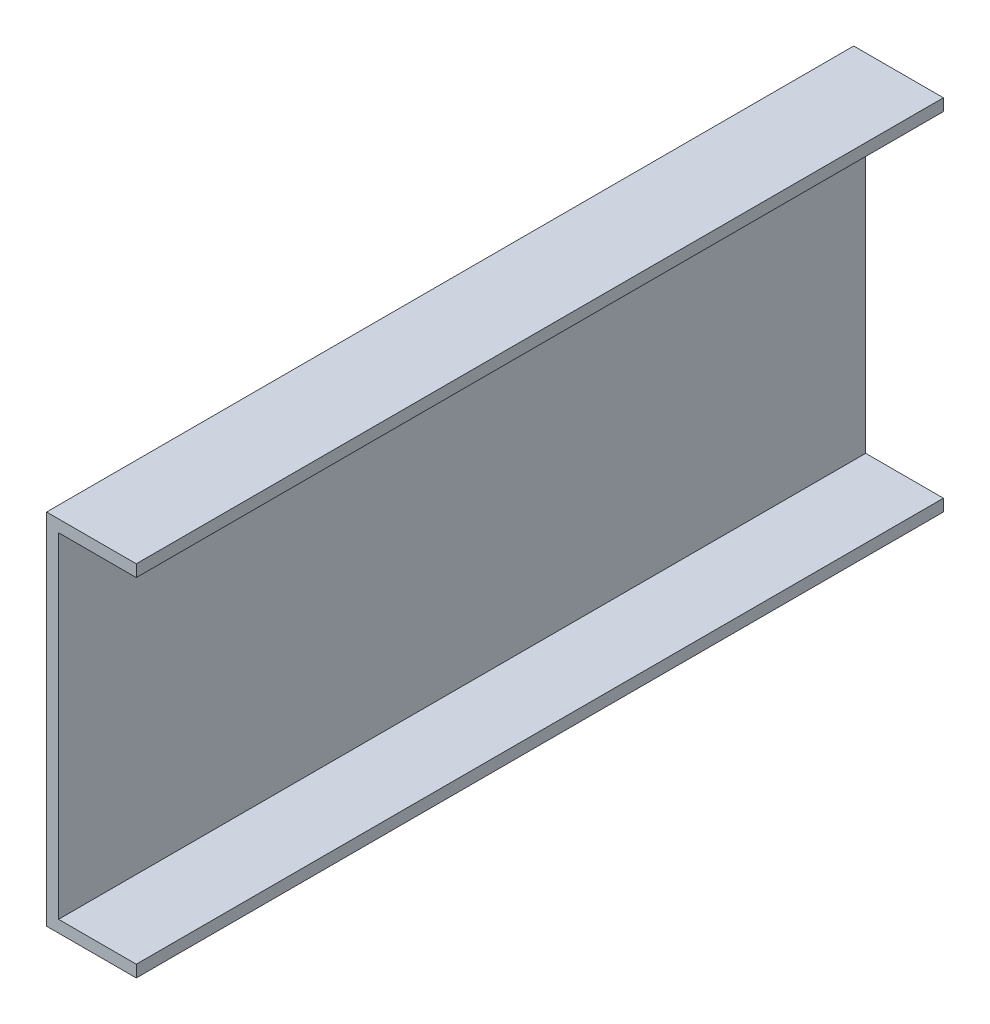
ISO-10303-21;
HEADER;
FILE_DESCRIPTION(('STEP AP214'),'2;1');
FILE_NAME('part.step','',(''),(''),'','','');
FILE_SCHEMA(('AUTOMOTIVE_DESIGN { 1 0 10303 214 1 1 1 1 }'));
ENDSEC;
DATA;
#1=APPLICATION_CONTEXT('core data for automotive mechanical design processes');
#2=APPLICATION_PROTOCOL_DEFINITION('international standard','automotive_design',2000,#1);
#3=PRODUCT_CONTEXT('',#1,'mechanical');
#4=PRODUCT('Part','Part','',(#3));
#5=PRODUCT_RELATED_PRODUCT_CATEGORY('part','',(#4));
#6=PRODUCT_DEFINITION_FORMATION('','',#4);
#7=PRODUCT_DEFINITION_CONTEXT('part definition',#1,'design');
#8=PRODUCT_DEFINITION('design','',#6,#7);
#9=PRODUCT_DEFINITION_SHAPE('','',#8);
#10=(LENGTH_UNIT() NAMED_UNIT(*) SI_UNIT(.MILLI.,.METRE.));
#11=(NAMED_UNIT(*) PLANE_ANGLE_UNIT() SI_UNIT($,.RADIAN.));
#12=(NAMED_UNIT(*) SI_UNIT($,.STERADIAN.) SOLID_ANGLE_UNIT());
#13=UNCERTAINTY_MEASURE_WITH_UNIT(LENGTH_MEASURE(1.E-05),#10,'distance_accuracy_value','');
#14=(GEOMETRIC_REPRESENTATION_CONTEXT(3) GLOBAL_UNCERTAINTY_ASSIGNED_CONTEXT((#13)) GLOBAL_UNIT_ASSIGNED_CONTEXT((#10,
#11,#12)) REPRESENTATION_CONTEXT('',''));
#15=CARTESIAN_POINT('',(0.,0.,0.));
#16=DIRECTION('',(0.,0.,1.));
#17=DIRECTION('',(1.,0.,0.));
#18=AXIS2_PLACEMENT_3D('',#15,#16,#17);
#19=CARTESIAN_POINT('',(-74.3300613496932,42.1047852760736,171.45));
#20=DIRECTION('',(0.,1.,0.));
#21=DIRECTION('',(0.,0.,1.));
#22=AXIS2_PLACEMENT_3D('',#19,#20,#21);
#23=PLANE('',#22);
#24=DIRECTION('',(1.,0.,0.));
#25=VECTOR('',#24,1.);
#26=CARTESIAN_POINT('',(-74.3300613496932,42.1047852760736,0.));
#27=LINE('',#26,#25);
#28=CARTESIAN_POINT('',(-71.7900613496932,42.1047852760736,0.));
#29=VERTEX_POINT('',#28);
#30=CARTESIAN_POINT('',(-55.2800613496932,42.1047852760736,0.));
#31=VERTEX_POINT('',#30);
#32=EDGE_CURVE('E132',#29,#31,#27,.T.);
#33=ORIENTED_EDGE('',*,*,#32,.T.);
#34=DIRECTION('',(0.,0.,-1.));
#35=VECTOR('',#34,1.);
#36=CARTESIAN_POINT('',(-55.2800613496932,42.1047852760736,171.45));
#37=LINE('',#36,#35);
#38=CARTESIAN_POINT('',(-55.2800613496932,42.1047852760736,171.45));
#39=VERTEX_POINT('',#38);
#40=EDGE_CURVE('E11',#39,#31,#37,.T.);
#41=ORIENTED_EDGE('',*,*,#40,.F.);
#42=DIRECTION('',(1.,0.,0.));
#43=VECTOR('',#42,1.);
#44=CARTESIAN_POINT('',(-74.3300613496932,42.1047852760736,171.45));
#45=LINE('',#44,#43);
#46=CARTESIAN_POINT('',(-71.7900613496932,42.1047852760736,171.45));
#47=VERTEX_POINT('',#46);
#48=EDGE_CURVE('E90',#47,#39,#45,.T.);
#49=ORIENTED_EDGE('',*,*,#48,.F.);
#50=DIRECTION('',(0.,0.,-1.));
#51=VECTOR('',#50,1.);
#52=CARTESIAN_POINT('',(-71.7900613496932,42.1047852760736,171.45));
#53=LINE('',#52,#51);
#54=EDGE_CURVE('E131',#47,#29,#53,.T.);
#55=ORIENTED_EDGE('',*,*,#54,.T.);
#56=EDGE_LOOP('',(#33,#41,#49,#55));
#57=FACE_BOUND('',#56,.T.);
#58=ADVANCED_FACE('F35',(#57),#23,.F.);
#59=CARTESIAN_POINT('',(-55.2800613496932,44.6447852760736,171.45));
#60=DIRECTION('',(1.,0.,0.));
#61=DIRECTION('',(0.,0.,-1.));
#62=AXIS2_PLACEMENT_3D('',#59,#60,#61);
#63=PLANE('',#62);
#64=DIRECTION('',(0.,-1.,0.));
#65=VECTOR('',#64,1.);
#66=CARTESIAN_POINT('',(-55.2800613496932,44.6447852760736,0.));
#67=LINE('',#66,#65);
#68=CARTESIAN_POINT('',(-55.2800613496932,44.6447852760736,0.));
#69=VERTEX_POINT('',#68);
#70=EDGE_CURVE('E135',#69,#31,#67,.T.);
#71=ORIENTED_EDGE('',*,*,#70,.F.);
#72=DIRECTION('',(0.,0.,-1.));
#73=VECTOR('',#72,1.);
#74=CARTESIAN_POINT('',(-55.2800613496932,44.6447852760736,171.45));
#75=LINE('',#74,#73);
#76=CARTESIAN_POINT('',(-55.2800613496932,44.6447852760736,171.45));
#77=VERTEX_POINT('',#76);
#78=EDGE_CURVE('E43',#77,#69,#75,.T.);
#79=ORIENTED_EDGE('',*,*,#78,.F.);
#80=DIRECTION('',(0.,-1.,0.));
#81=VECTOR('',#80,1.);
#82=CARTESIAN_POINT('',(-55.2800613496932,44.6447852760736,171.45));
#83=LINE('',#82,#81);
#84=EDGE_CURVE('E174',#77,#39,#83,.T.);
#85=ORIENTED_EDGE('',*,*,#84,.T.);
#86=ORIENTED_EDGE('',*,*,#40,.T.);
#87=EDGE_LOOP('',(#71,#79,#85,#86));
#88=FACE_BOUND('',#87,.T.);
#89=ADVANCED_FACE('F165',(#88),#63,.T.);
#90=CARTESIAN_POINT('',(-74.3300613496932,44.6447852760736,171.45));
#91=DIRECTION('',(0.,1.,0.));
#92=DIRECTION('',(0.,0.,1.));
#93=AXIS2_PLACEMENT_3D('',#90,#91,#92);
#94=PLANE('',#93);
#95=DIRECTION('',(1.,0.,0.));
#96=VECTOR('',#95,1.);
#97=CARTESIAN_POINT('',(-74.3300613496932,44.6447852760736,0.));
#98=LINE('',#97,#96);
#99=CARTESIAN_POINT('',(-74.3300613496932,44.6447852760736,0.));
#100=VERTEX_POINT('',#99);
#101=EDGE_CURVE('E138',#100,#69,#98,.T.);
#102=ORIENTED_EDGE('',*,*,#101,.F.);
#103=DIRECTION('',(0.,0.,-1.));
#104=VECTOR('',#103,1.);
#105=CARTESIAN_POINT('',(-74.3300613496932,44.6447852760736,171.45));
#106=LINE('',#105,#104);
#107=CARTESIAN_POINT('',(-74.3300613496932,44.6447852760736,171.45));
#108=VERTEX_POINT('',#107);
#109=EDGE_CURVE('E155',#108,#100,#106,.T.);
#110=ORIENTED_EDGE('',*,*,#109,.F.);
#111=DIRECTION('',(1.,0.,0.));
#112=VECTOR('',#111,1.);
#113=CARTESIAN_POINT('',(-74.3300613496932,44.6447852760736,171.45));
#114=LINE('',#113,#112);
#115=EDGE_CURVE('E162',#108,#77,#114,.T.);
#116=ORIENTED_EDGE('',*,*,#115,.T.);
#117=ORIENTED_EDGE('',*,*,#78,.T.);
#118=EDGE_LOOP('',(#102,#110,#116,#117));
#119=FACE_BOUND('',#118,.T.);
#120=ADVANCED_FACE('F160',(#119),#94,.T.);
#121=CARTESIAN_POINT('',(-74.3300613496932,44.6447852760736,171.45));
#122=DIRECTION('',(-1.,0.,0.));
#123=DIRECTION('',(0.,0.,1.));
#124=AXIS2_PLACEMENT_3D('',#121,#122,#123);
#125=PLANE('',#124);
#126=DIRECTION('',(0.,1.,0.));
#127=VECTOR('',#126,1.);
#128=CARTESIAN_POINT('',(-74.3300613496932,44.6447852760736,0.));
#129=LINE('',#128,#127);
#130=CARTESIAN_POINT('',(-74.3300613496932,-31.5552147239264,0.));
#131=VERTEX_POINT('',#130);
#132=EDGE_CURVE('E141',#131,#100,#129,.T.);
#133=ORIENTED_EDGE('',*,*,#132,.F.);
#134=DIRECTION('',(0.,0.,-1.));
#135=VECTOR('',#134,1.);
#136=CARTESIAN_POINT('',(-74.3300613496932,-31.5552147239264,171.45));
#137=LINE('',#136,#135);
#138=CARTESIAN_POINT('',(-74.3300613496932,-31.5552147239264,171.45));
#139=VERTEX_POINT('',#138);
#140=EDGE_CURVE('E153',#139,#131,#137,.T.);
#141=ORIENTED_EDGE('',*,*,#140,.F.);
#142=DIRECTION('',(0.,1.,0.));
#143=VECTOR('',#142,1.);
#144=CARTESIAN_POINT('',(-74.3300613496932,44.6447852760736,171.45));
#145=LINE('',#144,#143);
#146=EDGE_CURVE('E126',#139,#108,#145,.T.);
#147=ORIENTED_EDGE('',*,*,#146,.T.);
#148=ORIENTED_EDGE('',*,*,#109,.T.);
#149=EDGE_LOOP('',(#133,#141,#147,#148));
#150=FACE_BOUND('',#149,.T.);
#151=ADVANCED_FACE('F172',(#150),#125,.T.);
#152=CARTESIAN_POINT('',(-74.3300613496932,-31.5552147239264,171.45));
#153=DIRECTION('',(0.,-1.,0.));
#154=DIRECTION('',(0.,0.,-1.));
#155=AXIS2_PLACEMENT_3D('',#152,#153,#154);
#156=PLANE('',#155);
#157=DIRECTION('',(-1.,0.,0.));
#158=VECTOR('',#157,1.);
#159=CARTESIAN_POINT('',(-74.3300613496932,-31.5552147239264,0.));
#160=LINE('',#159,#158);
#161=CARTESIAN_POINT('',(-55.2800613496932,-31.5552147239264,0.));
#162=VERTEX_POINT('',#161);
#163=EDGE_CURVE('E144',#162,#131,#160,.T.);
#164=ORIENTED_EDGE('',*,*,#163,.F.);
#165=DIRECTION('',(0.,0.,-1.));
#166=VECTOR('',#165,1.);
#167=CARTESIAN_POINT('',(-55.2800613496932,-31.5552147239264,171.45));
#168=LINE('',#167,#166);
#169=CARTESIAN_POINT('',(-55.2800613496932,-31.5552147239264,171.45));
#170=VERTEX_POINT('',#169);
#171=EDGE_CURVE('E114',#170,#162,#168,.T.);
#172=ORIENTED_EDGE('',*,*,#171,.F.);
#173=DIRECTION('',(-1.,0.,0.));
#174=VECTOR('',#173,1.);
#175=CARTESIAN_POINT('',(-74.3300613496932,-31.5552147239264,171.45));
#176=LINE('',#175,#174);
#177=EDGE_CURVE('E124',#170,#139,#176,.T.);
#178=ORIENTED_EDGE('',*,*,#177,.T.);
#179=ORIENTED_EDGE('',*,*,#140,.T.);
#180=EDGE_LOOP('',(#164,#172,#178,#179));
#181=FACE_BOUND('',#180,.T.);
#182=ADVANCED_FACE('F179',(#181),#156,.T.);
#183=CARTESIAN_POINT('',(-55.2800613496932,-29.0152147239264,171.45));
#184=DIRECTION('',(1.,0.,0.));
#185=DIRECTION('',(0.,0.,-1.));
#186=AXIS2_PLACEMENT_3D('',#183,#184,#185);
#187=PLANE('',#186);
#188=DIRECTION('',(0.,-1.,0.));
#189=VECTOR('',#188,1.);
#190=CARTESIAN_POINT('',(-55.2800613496932,-29.0152147239264,0.));
#191=LINE('',#190,#189);
#192=CARTESIAN_POINT('',(-55.2800613496932,-29.0152147239264,0.));
#193=VERTEX_POINT('',#192);
#194=EDGE_CURVE('E113',#193,#162,#191,.T.);
#195=ORIENTED_EDGE('',*,*,#194,.F.);
#196=DIRECTION('',(0.,0.,-1.));
#197=VECTOR('',#196,1.);
#198=CARTESIAN_POINT('',(-55.2800613496932,-29.0152147239264,171.45));
#199=LINE('',#198,#197);
#200=CARTESIAN_POINT('',(-55.2800613496932,-29.0152147239264,171.45));
#201=VERTEX_POINT('',#200);
#202=EDGE_CURVE('E107',#201,#193,#199,.T.);
#203=ORIENTED_EDGE('',*,*,#202,.F.);
#204=DIRECTION('',(0.,-1.,0.));
#205=VECTOR('',#204,1.);
#206=CARTESIAN_POINT('',(-55.2800613496932,-29.0152147239264,171.45));
#207=LINE('',#206,#205);
#208=EDGE_CURVE('E111',#201,#170,#207,.T.);
#209=ORIENTED_EDGE('',*,*,#208,.T.);
#210=ORIENTED_EDGE('',*,*,#171,.T.);
#211=EDGE_LOOP('',(#195,#203,#209,#210));
#212=FACE_BOUND('',#211,.T.);
#213=ADVANCED_FACE('F109',(#212),#187,.T.);
#214=CARTESIAN_POINT('',(-74.3300613496932,-29.0152147239264,171.45));
#215=DIRECTION('',(0.,-1.,0.));
#216=DIRECTION('',(0.,0.,-1.));
#217=AXIS2_PLACEMENT_3D('',#214,#215,#216);
#218=PLANE('',#217);
#219=DIRECTION('',(1.,0.,0.));
#220=VECTOR('',#219,1.);
#221=CARTESIAN_POINT('',(-74.3300613496932,-29.0152147239264,0.));
#222=LINE('',#221,#220);
#223=CARTESIAN_POINT('',(-71.7900613496932,-29.0152147239264,0.));
#224=VERTEX_POINT('',#223);
#225=EDGE_CURVE('E78',#193,#224,#222,.F.);
#226=ORIENTED_EDGE('',*,*,#225,.T.);
#227=DIRECTION('',(0.,0.,-1.));
#228=VECTOR('',#227,1.);
#229=CARTESIAN_POINT('',(-71.7900613496932,-29.0152147239264,171.45));
#230=LINE('',#229,#228);
#231=CARTESIAN_POINT('',(-71.7900613496932,-29.0152147239264,171.45));
#232=VERTEX_POINT('',#231);
#233=EDGE_CURVE('E115',#232,#224,#230,.T.);
#234=ORIENTED_EDGE('',*,*,#233,.F.);
#235=DIRECTION('',(1.,0.,0.));
#236=VECTOR('',#235,1.);
#237=CARTESIAN_POINT('',(-74.3300613496932,-29.0152147239264,171.45));
#238=LINE('',#237,#236);
#239=EDGE_CURVE('E117',#201,#232,#238,.F.);
#240=ORIENTED_EDGE('',*,*,#239,.F.);
#241=ORIENTED_EDGE('',*,*,#202,.T.);
#242=EDGE_LOOP('',(#226,#234,#240,#241));
#243=FACE_BOUND('',#242,.T.);
#244=ADVANCED_FACE('F118',(#243),#218,.F.);
#245=CARTESIAN_POINT('',(-71.7900613496932,44.6447852760736,171.45));
#246=DIRECTION('',(-1.,0.,0.));
#247=DIRECTION('',(0.,0.,1.));
#248=AXIS2_PLACEMENT_3D('',#245,#246,#247);
#249=PLANE('',#248);
#250=DIRECTION('',(0.,1.,0.));
#251=VECTOR('',#250,1.);
#252=CARTESIAN_POINT('',(-71.7900613496932,44.6447852760736,0.));
#253=LINE('',#252,#251);
#254=EDGE_CURVE('E84',#224,#29,#253,.T.);
#255=ORIENTED_EDGE('',*,*,#254,.T.);
#256=ORIENTED_EDGE('',*,*,#54,.F.);
#257=DIRECTION('',(0.,1.,0.));
#258=VECTOR('',#257,1.);
#259=CARTESIAN_POINT('',(-71.7900613496932,44.6447852760736,171.45));
#260=LINE('',#259,#258);
#261=EDGE_CURVE('E51',#232,#47,#260,.T.);
#262=ORIENTED_EDGE('',*,*,#261,.F.);
#263=ORIENTED_EDGE('',*,*,#233,.T.);
#264=EDGE_LOOP('',(#255,#256,#262,#263));
#265=FACE_BOUND('',#264,.T.);
#266=ADVANCED_FACE('F181',(#265),#249,.F.);
#267=CARTESIAN_POINT('',(0.,0.,171.45));
#268=DIRECTION('',(0.,0.,-1.));
#269=DIRECTION('',(-1.,0.,0.));
#270=AXIS2_PLACEMENT_3D('',#267,#268,#269);
#271=PLANE('',#270);
#272=ORIENTED_EDGE('',*,*,#48,.T.);
#273=ORIENTED_EDGE('',*,*,#84,.F.);
#274=ORIENTED_EDGE('',*,*,#115,.F.);
#275=ORIENTED_EDGE('',*,*,#146,.F.);
#276=ORIENTED_EDGE('',*,*,#177,.F.);
#277=ORIENTED_EDGE('',*,*,#208,.F.);
#278=ORIENTED_EDGE('',*,*,#239,.T.);
#279=ORIENTED_EDGE('',*,*,#261,.T.);
#280=EDGE_LOOP('',(#272,#273,#274,#275,#276,#277,#278,#279));
#281=FACE_BOUND('',#280,.T.);
#282=ADVANCED_FACE('F121',(#281),#271,.F.);
#283=CARTESIAN_POINT('',(0.,0.,0.));
#284=DIRECTION('',(0.,0.,-1.));
#285=DIRECTION('',(-1.,0.,0.));
#286=AXIS2_PLACEMENT_3D('',#283,#284,#285);
#287=PLANE('',#286);
#288=ORIENTED_EDGE('',*,*,#32,.F.);
#289=ORIENTED_EDGE('',*,*,#254,.F.);
#290=ORIENTED_EDGE('',*,*,#225,.F.);
#291=ORIENTED_EDGE('',*,*,#194,.T.);
#292=ORIENTED_EDGE('',*,*,#163,.T.);
#293=ORIENTED_EDGE('',*,*,#132,.T.);
#294=ORIENTED_EDGE('',*,*,#101,.T.);
#295=ORIENTED_EDGE('',*,*,#70,.T.);
#296=EDGE_LOOP('',(#288,#289,#290,#291,#292,#293,#294,#295));
#297=FACE_BOUND('',#296,.T.);
#298=ADVANCED_FACE('F168',(#297),#287,.T.);
#299=CLOSED_SHELL('',(#58,#89,#120,#151,#182,#213,#244,#266,#282,#298));
#300=MANIFOLD_SOLID_BREP('B2',#299);
#301=ADVANCED_BREP_SHAPE_REPRESENTATION('',(#18,#300),#14);
#302=SHAPE_DEFINITION_REPRESENTATION(#9,#301);
ENDSEC;
END-ISO-10303-21;
